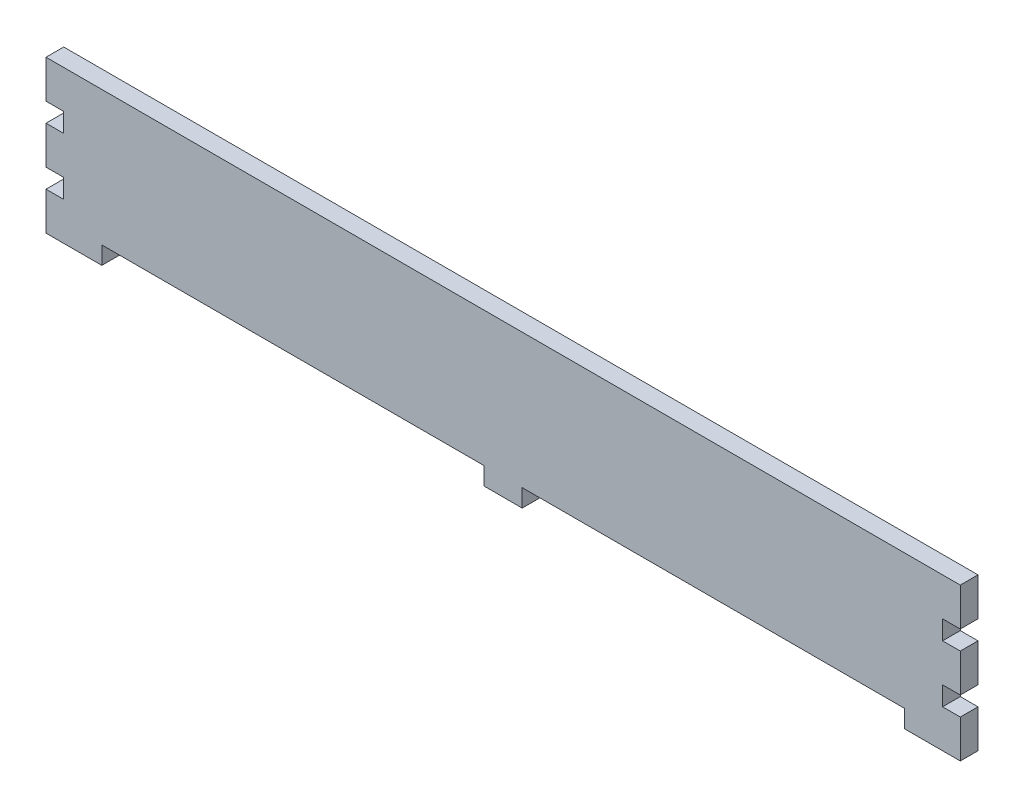
ISO-10303-21;
HEADER;
FILE_DESCRIPTION(('STEP AP214'),'2;1');
FILE_NAME('part.step','',(''),(''),'','','');
FILE_SCHEMA(('AUTOMOTIVE_DESIGN { 1 0 10303 214 1 1 1 1 }'));
ENDSEC;
DATA;
#1=APPLICATION_CONTEXT('core data for automotive mechanical design processes');
#2=APPLICATION_PROTOCOL_DEFINITION('international standard','automotive_design',2000,#1);
#3=PRODUCT_CONTEXT('',#1,'mechanical');
#4=PRODUCT('Part','Part','',(#3));
#5=PRODUCT_RELATED_PRODUCT_CATEGORY('part','',(#4));
#6=PRODUCT_DEFINITION_FORMATION('','',#4);
#7=PRODUCT_DEFINITION_CONTEXT('part definition',#1,'design');
#8=PRODUCT_DEFINITION('design','',#6,#7);
#9=PRODUCT_DEFINITION_SHAPE('','',#8);
#10=(LENGTH_UNIT() NAMED_UNIT(*) SI_UNIT(.MILLI.,.METRE.));
#11=(NAMED_UNIT(*) PLANE_ANGLE_UNIT() SI_UNIT($,.RADIAN.));
#12=(NAMED_UNIT(*) SI_UNIT($,.STERADIAN.) SOLID_ANGLE_UNIT());
#13=UNCERTAINTY_MEASURE_WITH_UNIT(LENGTH_MEASURE(1.E-05),#10,'distance_accuracy_value','');
#14=(GEOMETRIC_REPRESENTATION_CONTEXT(3) GLOBAL_UNCERTAINTY_ASSIGNED_CONTEXT((#13)) GLOBAL_UNIT_ASSIGNED_CONTEXT((#10,
#11,#12)) REPRESENTATION_CONTEXT('',''));
#15=CARTESIAN_POINT('',(0.,0.,0.));
#16=DIRECTION('',(0.,0.,1.));
#17=DIRECTION('',(1.,0.,0.));
#18=AXIS2_PLACEMENT_3D('',#15,#16,#17);
#19=CARTESIAN_POINT('',(140.590036334991,96.934215161976,11.81));
#20=DIRECTION('',(-1.,0.,0.));
#21=DIRECTION('',(0.,0.,1.));
#22=AXIS2_PLACEMENT_3D('',#19,#20,#21);
#23=PLANE('',#22);
#24=DIRECTION('',(0.,0.,1.));
#25=VECTOR('',#24,1.);
#26=CARTESIAN_POINT('',(140.590036334991,71.5342151619759,0.));
#27=LINE('',#26,#25);
#28=CARTESIAN_POINT('',(140.590036334991,71.5342151619759,0.));
#29=VERTEX_POINT('',#28);
#30=CARTESIAN_POINT('',(140.590036334991,71.5342151619759,11.81));
#31=VERTEX_POINT('',#30);
#32=EDGE_CURVE('E52',#29,#31,#27,.T.);
#33=ORIENTED_EDGE('',*,*,#32,.T.);
#34=DIRECTION('',(0.,1.,0.));
#35=VECTOR('',#34,1.);
#36=CARTESIAN_POINT('',(140.590036334991,96.934215161976,11.81));
#37=LINE('',#36,#35);
#38=CARTESIAN_POINT('',(140.590036334991,58.8342151619759,11.81));
#39=VERTEX_POINT('',#38);
#40=EDGE_CURVE('E431',#39,#31,#37,.T.);
#41=ORIENTED_EDGE('',*,*,#40,.F.);
#42=DIRECTION('',(0.,0.,1.));
#43=VECTOR('',#42,1.);
#44=CARTESIAN_POINT('',(140.590036334991,58.8342151619759,0.));
#45=LINE('',#44,#43);
#46=CARTESIAN_POINT('',(140.590036334991,58.8342151619759,0.));
#47=VERTEX_POINT('',#46);
#48=EDGE_CURVE('E282',#47,#39,#45,.T.);
#49=ORIENTED_EDGE('',*,*,#48,.F.);
#50=DIRECTION('',(0.,1.,0.));
#51=VECTOR('',#50,1.);
#52=CARTESIAN_POINT('',(140.590036334991,96.934215161976,0.));
#53=LINE('',#52,#51);
#54=EDGE_CURVE('E57',#47,#29,#53,.T.);
#55=ORIENTED_EDGE('',*,*,#54,.T.);
#56=EDGE_LOOP('',(#33,#41,#49,#55));
#57=FACE_BOUND('',#56,.T.);
#58=ADVANCED_FACE('F35',(#57),#23,.F.);
#59=DIRECTION('',(0.,0.,1.));
#60=VECTOR('',#59,1.);
#61=CARTESIAN_POINT('',(140.590036334991,33.4342151619759,0.));
#62=LINE('',#61,#60);
#63=CARTESIAN_POINT('',(140.590036334991,33.4342151619759,0.));
#64=VERTEX_POINT('',#63);
#65=CARTESIAN_POINT('',(140.590036334991,33.4342151619759,11.81));
#66=VERTEX_POINT('',#65);
#67=EDGE_CURVE('E280',#64,#66,#62,.T.);
#68=ORIENTED_EDGE('',*,*,#67,.T.);
#69=CARTESIAN_POINT('',(140.590036334991,20.7342151619759,11.81));
#70=VERTEX_POINT('',#69);
#71=EDGE_CURVE('E428',#70,#66,#37,.T.);
#72=ORIENTED_EDGE('',*,*,#71,.F.);
#73=DIRECTION('',(0.,0.,1.));
#74=VECTOR('',#73,1.);
#75=CARTESIAN_POINT('',(140.590036334991,20.7342151619759,0.));
#76=LINE('',#75,#74);
#77=CARTESIAN_POINT('',(140.590036334991,20.7342151619759,0.));
#78=VERTEX_POINT('',#77);
#79=EDGE_CURVE('E301',#78,#70,#76,.T.);
#80=ORIENTED_EDGE('',*,*,#79,.F.);
#81=EDGE_CURVE('E235',#78,#64,#53,.T.);
#82=ORIENTED_EDGE('',*,*,#81,.T.);
#83=EDGE_LOOP('',(#68,#72,#80,#82));
#84=FACE_BOUND('',#83,.T.);
#85=ADVANCED_FACE('F37',(#84),#23,.F.);
#86=CARTESIAN_POINT('',(-445.39,96.934215161976,11.81));
#87=DIRECTION('',(1.,0.,0.));
#88=DIRECTION('',(0.,0.,-1.));
#89=AXIS2_PLACEMENT_3D('',#86,#87,#88);
#90=PLANE('',#89);
#91=DIRECTION('',(0.,-1.,0.));
#92=VECTOR('',#91,1.);
#93=CARTESIAN_POINT('',(-445.39,96.934215161976,11.81));
#94=LINE('',#93,#92);
#95=CARTESIAN_POINT('',(-445.39,71.5342151619758,11.81));
#96=VERTEX_POINT('',#95);
#97=CARTESIAN_POINT('',(-445.39,58.8342151619758,11.81));
#98=VERTEX_POINT('',#97);
#99=EDGE_CURVE('E434',#96,#98,#94,.T.);
#100=ORIENTED_EDGE('',*,*,#99,.F.);
#101=DIRECTION('',(0.,0.,1.));
#102=VECTOR('',#101,1.);
#103=CARTESIAN_POINT('',(-445.39,71.5342151619758,0.));
#104=LINE('',#103,#102);
#105=CARTESIAN_POINT('',(-445.39,71.5342151619758,0.));
#106=VERTEX_POINT('',#105);
#107=EDGE_CURVE('E319',#106,#96,#104,.T.);
#108=ORIENTED_EDGE('',*,*,#107,.F.);
#109=DIRECTION('',(0.,-1.,0.));
#110=VECTOR('',#109,1.);
#111=CARTESIAN_POINT('',(-445.39,96.934215161976,0.));
#112=LINE('',#111,#110);
#113=CARTESIAN_POINT('',(-445.39,58.8342151619758,0.));
#114=VERTEX_POINT('',#113);
#115=EDGE_CURVE('E436',#106,#114,#112,.T.);
#116=ORIENTED_EDGE('',*,*,#115,.T.);
#117=DIRECTION('',(0.,0.,1.));
#118=VECTOR('',#117,1.);
#119=CARTESIAN_POINT('',(-445.39,58.8342151619758,0.));
#120=LINE('',#119,#118);
#121=EDGE_CURVE('E344',#114,#98,#120,.T.);
#122=ORIENTED_EDGE('',*,*,#121,.T.);
#123=EDGE_LOOP('',(#100,#108,#116,#122));
#124=FACE_BOUND('',#123,.T.);
#125=ADVANCED_FACE('F469',(#124),#90,.F.);
#126=CARTESIAN_POINT('',(-445.39,7.14421516197585,11.81));
#127=DIRECTION('',(0.,1.,0.));
#128=DIRECTION('',(-1.,0.,0.));
#129=AXIS2_PLACEMENT_3D('',#126,#127,#128);
#130=PLANE('',#129);
#131=DIRECTION('',(1.,0.,0.));
#132=VECTOR('',#131,1.);
#133=CARTESIAN_POINT('',(-445.39,7.14421516197585,0.));
#134=LINE('',#133,#132);
#135=CARTESIAN_POINT('',(-419.99,7.14421516197584,0.));
#136=VERTEX_POINT('',#135);
#137=CARTESIAN_POINT('',(-165.099981832504,7.14421516197579,0.));
#138=VERTEX_POINT('',#137);
#139=EDGE_CURVE('E39',#136,#138,#134,.T.);
#140=ORIENTED_EDGE('',*,*,#139,.T.);
#141=DIRECTION('',(0.,0.,1.));
#142=VECTOR('',#141,1.);
#143=CARTESIAN_POINT('',(-165.099981832504,7.14421516197579,0.));
#144=LINE('',#143,#142);
#145=CARTESIAN_POINT('',(-165.099981832504,7.14421516197579,11.81));
#146=VERTEX_POINT('',#145);
#147=EDGE_CURVE('E403',#138,#146,#144,.T.);
#148=ORIENTED_EDGE('',*,*,#147,.T.);
#149=DIRECTION('',(1.,0.,0.));
#150=VECTOR('',#149,1.);
#151=CARTESIAN_POINT('',(-445.39,7.14421516197585,11.81));
#152=LINE('',#151,#150);
#153=CARTESIAN_POINT('',(-419.99,7.14421516197585,11.81));
#154=VERTEX_POINT('',#153);
#155=EDGE_CURVE('E11',#154,#146,#152,.T.);
#156=ORIENTED_EDGE('',*,*,#155,.F.);
#157=DIRECTION('',(0.,0.,1.));
#158=VECTOR('',#157,1.);
#159=CARTESIAN_POINT('',(-419.99,7.14421516197585,0.));
#160=LINE('',#159,#158);
#161=EDGE_CURVE('E424',#136,#154,#160,.T.);
#162=ORIENTED_EDGE('',*,*,#161,.F.);
#163=EDGE_LOOP('',(#140,#148,#156,#162));
#164=FACE_BOUND('',#163,.T.);
#165=ADVANCED_FACE('F534',(#164),#130,.F.);
#166=CARTESIAN_POINT('',(-139.699981832504,7.14421516197579,0.));
#167=VERTEX_POINT('',#166);
#168=CARTESIAN_POINT('',(115.190036334991,7.14421516197574,0.));
#169=VERTEX_POINT('',#168);
#170=EDGE_CURVE('E437',#167,#169,#134,.T.);
#171=ORIENTED_EDGE('',*,*,#170,.T.);
#172=DIRECTION('',(0.,0.,1.));
#173=VECTOR('',#172,1.);
#174=CARTESIAN_POINT('',(115.190036334991,7.14421516197573,0.));
#175=LINE('',#174,#173);
#176=CARTESIAN_POINT('',(115.190036334991,7.14421516197574,11.81));
#177=VERTEX_POINT('',#176);
#178=EDGE_CURVE('E381',#169,#177,#175,.T.);
#179=ORIENTED_EDGE('',*,*,#178,.T.);
#180=CARTESIAN_POINT('',(-139.699981832504,7.14421516197579,11.81));
#181=VERTEX_POINT('',#180);
#182=EDGE_CURVE('E44',#181,#177,#152,.T.);
#183=ORIENTED_EDGE('',*,*,#182,.F.);
#184=DIRECTION('',(0.,0.,1.));
#185=VECTOR('',#184,1.);
#186=CARTESIAN_POINT('',(-139.699981832504,7.14421516197579,0.));
#187=LINE('',#186,#185);
#188=EDGE_CURVE('E406',#167,#181,#187,.T.);
#189=ORIENTED_EDGE('',*,*,#188,.F.);
#190=EDGE_LOOP('',(#171,#179,#183,#189));
#191=FACE_BOUND('',#190,.T.);
#192=ADVANCED_FACE('F512',(#191),#130,.F.);
#193=CARTESIAN_POINT('',(-445.39,96.934215161976,11.81));
#194=DIRECTION('',(0.,-1.,0.));
#195=DIRECTION('',(0.,0.,-1.));
#196=AXIS2_PLACEMENT_3D('',#193,#194,#195);
#197=PLANE('',#196);
#198=DIRECTION('',(-1.,0.,0.));
#199=VECTOR('',#198,1.);
#200=CARTESIAN_POINT('',(-445.39,96.934215161976,0.));
#201=LINE('',#200,#199);
#202=CARTESIAN_POINT('',(152.400036334991,96.9342151619759,0.));
#203=VERTEX_POINT('',#202);
#204=CARTESIAN_POINT('',(-457.2,96.9342151619758,0.));
#205=VERTEX_POINT('',#204);
#206=EDGE_CURVE('E221',#203,#205,#201,.T.);
#207=ORIENTED_EDGE('',*,*,#206,.T.);
#208=DIRECTION('',(0.,0.,1.));
#209=VECTOR('',#208,1.);
#210=CARTESIAN_POINT('',(-457.2,96.9342151619758,0.));
#211=LINE('',#210,#209);
#212=CARTESIAN_POINT('',(-457.2,96.9342151619758,11.81));
#213=VERTEX_POINT('',#212);
#214=EDGE_CURVE('E316',#205,#213,#211,.T.);
#215=ORIENTED_EDGE('',*,*,#214,.T.);
#216=DIRECTION('',(-1.,0.,0.));
#217=VECTOR('',#216,1.);
#218=CARTESIAN_POINT('',(-445.39,96.934215161976,11.81));
#219=LINE('',#218,#217);
#220=CARTESIAN_POINT('',(152.400036334991,96.9342151619759,11.81));
#221=VERTEX_POINT('',#220);
#222=EDGE_CURVE('E240',#221,#213,#219,.T.);
#223=ORIENTED_EDGE('',*,*,#222,.F.);
#224=DIRECTION('',(0.,0.,1.));
#225=VECTOR('',#224,1.);
#226=CARTESIAN_POINT('',(152.400036334991,96.9342151619759,0.));
#227=LINE('',#226,#225);
#228=EDGE_CURVE('E238',#203,#221,#227,.T.);
#229=ORIENTED_EDGE('',*,*,#228,.F.);
#230=EDGE_LOOP('',(#207,#215,#223,#229));
#231=FACE_BOUND('',#230,.T.);
#232=ADVANCED_FACE('F239',(#231),#197,.F.);
#233=CARTESIAN_POINT('',(-445.39,33.4342151619758,11.81));
#234=VERTEX_POINT('',#233);
#235=CARTESIAN_POINT('',(-445.39,20.7342151619759,11.81));
#236=VERTEX_POINT('',#235);
#237=EDGE_CURVE('E433',#234,#236,#94,.T.);
#238=ORIENTED_EDGE('',*,*,#237,.F.);
#239=DIRECTION('',(0.,0.,1.));
#240=VECTOR('',#239,1.);
#241=CARTESIAN_POINT('',(-445.39,33.4342151619758,0.));
#242=LINE('',#241,#240);
#243=CARTESIAN_POINT('',(-445.39,33.4342151619758,0.));
#244=VERTEX_POINT('',#243);
#245=EDGE_CURVE('E347',#244,#234,#242,.T.);
#246=ORIENTED_EDGE('',*,*,#245,.F.);
#247=CARTESIAN_POINT('',(-445.39,20.7342151619759,0.));
#248=VERTEX_POINT('',#247);
#249=EDGE_CURVE('E234',#244,#248,#112,.T.);
#250=ORIENTED_EDGE('',*,*,#249,.T.);
#251=DIRECTION('',(0.,0.,1.));
#252=VECTOR('',#251,1.);
#253=CARTESIAN_POINT('',(-445.39,20.7342151619759,0.));
#254=LINE('',#253,#252);
#255=EDGE_CURVE('E366',#248,#236,#254,.T.);
#256=ORIENTED_EDGE('',*,*,#255,.T.);
#257=EDGE_LOOP('',(#238,#246,#250,#256));
#258=FACE_BOUND('',#257,.T.);
#259=ADVANCED_FACE('F444',(#258),#90,.F.);
#260=CARTESIAN_POINT('',(0.,0.,11.81));
#261=DIRECTION('',(0.,0.,1.));
#262=DIRECTION('',(1.,0.,0.));
#263=AXIS2_PLACEMENT_3D('',#260,#261,#262);
#264=PLANE('',#263);
#265=DIRECTION('',(1.,0.,0.));
#266=VECTOR('',#265,1.);
#267=CARTESIAN_POINT('',(115.190036334991,-4.66578483802427,11.81));
#268=LINE('',#267,#266);
#269=CARTESIAN_POINT('',(115.190036334991,-4.66578483802427,11.81));
#270=VERTEX_POINT('',#269);
#271=CARTESIAN_POINT('',(152.400036334991,-4.6657848380241,11.81));
#272=VERTEX_POINT('',#271);
#273=EDGE_CURVE('E375',#270,#272,#268,.T.);
#274=ORIENTED_EDGE('',*,*,#273,.T.);
#275=DIRECTION('',(0.,-1.,0.));
#276=VECTOR('',#275,1.);
#277=CARTESIAN_POINT('',(152.400036334991,-4.6657848380241,11.81));
#278=LINE('',#277,#276);
#279=CARTESIAN_POINT('',(152.400036334991,20.7342151619759,11.81));
#280=VERTEX_POINT('',#279);
#281=EDGE_CURVE('E279',#280,#272,#278,.T.);
#282=ORIENTED_EDGE('',*,*,#281,.F.);
#283=DIRECTION('',(1.,0.,0.));
#284=VECTOR('',#283,1.);
#285=CARTESIAN_POINT('',(152.400036334991,20.7342151619759,11.81));
#286=LINE('',#285,#284);
#287=EDGE_CURVE('E291',#70,#280,#286,.T.);
#288=ORIENTED_EDGE('',*,*,#287,.F.);
#289=ORIENTED_EDGE('',*,*,#71,.T.);
#290=DIRECTION('',(-1.,0.,0.));
#291=VECTOR('',#290,1.);
#292=CARTESIAN_POINT('',(152.400036334991,33.4342151619759,11.81));
#293=LINE('',#292,#291);
#294=CARTESIAN_POINT('',(152.400036334991,33.4342151619759,11.81));
#295=VERTEX_POINT('',#294);
#296=EDGE_CURVE('E264',#295,#66,#293,.T.);
#297=ORIENTED_EDGE('',*,*,#296,.F.);
#298=DIRECTION('',(0.,-1.,0.));
#299=VECTOR('',#298,1.);
#300=CARTESIAN_POINT('',(152.400036334991,33.4342151619759,11.81));
#301=LINE('',#300,#299);
#302=CARTESIAN_POINT('',(152.400036334991,58.8342151619759,11.81));
#303=VERTEX_POINT('',#302);
#304=EDGE_CURVE('E258',#303,#295,#301,.T.);
#305=ORIENTED_EDGE('',*,*,#304,.F.);
#306=DIRECTION('',(1.,0.,0.));
#307=VECTOR('',#306,1.);
#308=CARTESIAN_POINT('',(152.400036334991,58.8342151619759,11.81));
#309=LINE('',#308,#307);
#310=EDGE_CURVE('E272',#39,#303,#309,.T.);
#311=ORIENTED_EDGE('',*,*,#310,.F.);
#312=ORIENTED_EDGE('',*,*,#40,.T.);
#313=DIRECTION('',(-1.,0.,0.));
#314=VECTOR('',#313,1.);
#315=CARTESIAN_POINT('',(152.400036334991,71.5342151619759,11.81));
#316=LINE('',#315,#314);
#317=CARTESIAN_POINT('',(152.400036334991,71.5342151619759,11.81));
#318=VERTEX_POINT('',#317);
#319=EDGE_CURVE('E249',#318,#31,#316,.T.);
#320=ORIENTED_EDGE('',*,*,#319,.F.);
#321=DIRECTION('',(0.,-1.,0.));
#322=VECTOR('',#321,1.);
#323=CARTESIAN_POINT('',(152.400036334991,71.5342151619759,11.81));
#324=LINE('',#323,#322);
#325=EDGE_CURVE('E253',#221,#318,#324,.T.);
#326=ORIENTED_EDGE('',*,*,#325,.F.);
#327=ORIENTED_EDGE('',*,*,#222,.T.);
#328=DIRECTION('',(0.,-1.,0.));
#329=VECTOR('',#328,1.);
#330=CARTESIAN_POINT('',(-457.2,71.5342151619758,11.81));
#331=LINE('',#330,#329);
#332=CARTESIAN_POINT('',(-457.2,71.5342151619758,11.81));
#333=VERTEX_POINT('',#332);
#334=EDGE_CURVE('E300',#213,#333,#331,.T.);
#335=ORIENTED_EDGE('',*,*,#334,.T.);
#336=DIRECTION('',(1.,0.,0.));
#337=VECTOR('',#336,1.);
#338=CARTESIAN_POINT('',(-457.2,71.5342151619758,11.81));
#339=LINE('',#338,#337);
#340=EDGE_CURVE('E308',#333,#96,#339,.T.);
#341=ORIENTED_EDGE('',*,*,#340,.T.);
#342=ORIENTED_EDGE('',*,*,#99,.T.);
#343=DIRECTION('',(-1.,0.,0.));
#344=VECTOR('',#343,1.);
#345=CARTESIAN_POINT('',(-457.2,58.8342151619758,11.81));
#346=LINE('',#345,#344);
#347=CARTESIAN_POINT('',(-457.2,58.8342151619758,11.81));
#348=VERTEX_POINT('',#347);
#349=EDGE_CURVE('E327',#98,#348,#346,.T.);
#350=ORIENTED_EDGE('',*,*,#349,.T.);
#351=DIRECTION('',(0.,-1.,0.));
#352=VECTOR('',#351,1.);
#353=CARTESIAN_POINT('',(-457.2,33.4342151619758,11.81));
#354=LINE('',#353,#352);
#355=CARTESIAN_POINT('',(-457.2,33.4342151619758,11.81));
#356=VERTEX_POINT('',#355);
#357=EDGE_CURVE('E318',#348,#356,#354,.T.);
#358=ORIENTED_EDGE('',*,*,#357,.T.);
#359=DIRECTION('',(1.,0.,0.));
#360=VECTOR('',#359,1.);
#361=CARTESIAN_POINT('',(-457.2,33.4342151619758,11.81));
#362=LINE('',#361,#360);
#363=EDGE_CURVE('E336',#356,#234,#362,.T.);
#364=ORIENTED_EDGE('',*,*,#363,.T.);
#365=ORIENTED_EDGE('',*,*,#237,.T.);
#366=DIRECTION('',(-1.,0.,0.));
#367=VECTOR('',#366,1.);
#368=CARTESIAN_POINT('',(-457.2,20.7342151619759,11.81));
#369=LINE('',#368,#367);
#370=CARTESIAN_POINT('',(-457.2,20.7342151619759,11.81));
#371=VERTEX_POINT('',#370);
#372=EDGE_CURVE('E355',#236,#371,#369,.T.);
#373=ORIENTED_EDGE('',*,*,#372,.T.);
#374=DIRECTION('',(0.,-1.,0.));
#375=VECTOR('',#374,1.);
#376=CARTESIAN_POINT('',(-457.2,-4.66578483802416,11.81));
#377=LINE('',#376,#375);
#378=CARTESIAN_POINT('',(-457.2,-4.66578483802416,11.81));
#379=VERTEX_POINT('',#378);
#380=EDGE_CURVE('E343',#371,#379,#377,.T.);
#381=ORIENTED_EDGE('',*,*,#380,.T.);
#382=DIRECTION('',(1.,0.,0.));
#383=VECTOR('',#382,1.);
#384=CARTESIAN_POINT('',(-445.39,-4.66578483802416,11.81));
#385=LINE('',#384,#383);
#386=CARTESIAN_POINT('',(-419.99,-4.66578483802416,11.81));
#387=VERTEX_POINT('',#386);
#388=EDGE_CURVE('E405',#379,#387,#385,.T.);
#389=ORIENTED_EDGE('',*,*,#388,.T.);
#390=DIRECTION('',(0.,1.,0.));
#391=VECTOR('',#390,1.);
#392=CARTESIAN_POINT('',(-419.99,-4.66578483802416,11.81));
#393=LINE('',#392,#391);
#394=EDGE_CURVE('E416',#387,#154,#393,.T.);
#395=ORIENTED_EDGE('',*,*,#394,.T.);
#396=ORIENTED_EDGE('',*,*,#155,.T.);
#397=DIRECTION('',(0.,-1.,0.));
#398=VECTOR('',#397,1.);
#399=CARTESIAN_POINT('',(-165.099981832504,-4.66578483802421,11.81));
#400=LINE('',#399,#398);
#401=CARTESIAN_POINT('',(-165.099981832504,-4.66578483802421,11.81));
#402=VERTEX_POINT('',#401);
#403=EDGE_CURVE('E383',#146,#402,#400,.T.);
#404=ORIENTED_EDGE('',*,*,#403,.T.);
#405=DIRECTION('',(1.,0.,0.));
#406=VECTOR('',#405,1.);
#407=CARTESIAN_POINT('',(-165.099981832504,-4.66578483802421,11.81));
#408=LINE('',#407,#406);
#409=CARTESIAN_POINT('',(-139.699981832504,-4.66578483802421,11.81));
#410=VERTEX_POINT('',#409);
#411=EDGE_CURVE('E398',#402,#410,#408,.T.);
#412=ORIENTED_EDGE('',*,*,#411,.T.);
#413=DIRECTION('',(0.,1.,0.));
#414=VECTOR('',#413,1.);
#415=CARTESIAN_POINT('',(-139.699981832504,-4.66578483802421,11.81));
#416=LINE('',#415,#414);
#417=EDGE_CURVE('E389',#410,#181,#416,.T.);
#418=ORIENTED_EDGE('',*,*,#417,.T.);
#419=ORIENTED_EDGE('',*,*,#182,.T.);
#420=DIRECTION('',(0.,-1.,0.));
#421=VECTOR('',#420,1.);
#422=CARTESIAN_POINT('',(115.190036334991,-4.66578483802427,11.81));
#423=LINE('',#422,#421);
#424=EDGE_CURVE('E365',#177,#270,#423,.T.);
#425=ORIENTED_EDGE('',*,*,#424,.T.);
#426=EDGE_LOOP('',(#274,#282,#288,#289,#297,#305,#311,#312,#320,#326,#327,#335,#341,#342,#350,
#358,#364,#365,#373,#381,#389,#395,#396,#404,#412,#418,#419,#425));
#427=FACE_BOUND('',#426,.T.);
#428=ADVANCED_FACE('F457',(#427),#264,.T.);
#429=CARTESIAN_POINT('',(0.,0.,0.));
#430=DIRECTION('',(0.,0.,1.));
#431=DIRECTION('',(1.,0.,0.));
#432=AXIS2_PLACEMENT_3D('',#429,#430,#431);
#433=PLANE('',#432);
#434=ORIENTED_EDGE('',*,*,#81,.F.);
#435=DIRECTION('',(1.,0.,0.));
#436=VECTOR('',#435,1.);
#437=CARTESIAN_POINT('',(152.400036334991,20.7342151619759,0.));
#438=LINE('',#437,#436);
#439=CARTESIAN_POINT('',(152.400036334991,20.7342151619759,0.));
#440=VERTEX_POINT('',#439);
#441=EDGE_CURVE('E290',#78,#440,#438,.T.);
#442=ORIENTED_EDGE('',*,*,#441,.T.);
#443=DIRECTION('',(0.,-1.,0.));
#444=VECTOR('',#443,1.);
#445=CARTESIAN_POINT('',(152.400036334991,-4.6657848380241,0.));
#446=LINE('',#445,#444);
#447=CARTESIAN_POINT('',(152.400036334991,-4.6657848380241,0.));
#448=VERTEX_POINT('',#447);
#449=EDGE_CURVE('E287',#440,#448,#446,.T.);
#450=ORIENTED_EDGE('',*,*,#449,.T.);
#451=DIRECTION('',(1.,0.,0.));
#452=VECTOR('',#451,1.);
#453=CARTESIAN_POINT('',(115.190036334991,-4.66578483802427,0.));
#454=LINE('',#453,#452);
#455=CARTESIAN_POINT('',(115.190036334991,-4.66578483802427,0.));
#456=VERTEX_POINT('',#455);
#457=EDGE_CURVE('E374',#456,#448,#454,.T.);
#458=ORIENTED_EDGE('',*,*,#457,.F.);
#459=DIRECTION('',(0.,-1.,0.));
#460=VECTOR('',#459,1.);
#461=CARTESIAN_POINT('',(115.190036334991,-4.66578483802427,0.));
#462=LINE('',#461,#460);
#463=EDGE_CURVE('E371',#169,#456,#462,.T.);
#464=ORIENTED_EDGE('',*,*,#463,.F.);
#465=ORIENTED_EDGE('',*,*,#170,.F.);
#466=DIRECTION('',(0.,1.,0.));
#467=VECTOR('',#466,1.);
#468=CARTESIAN_POINT('',(-139.699981832504,-4.66578483802421,0.));
#469=LINE('',#468,#467);
#470=CARTESIAN_POINT('',(-139.699981832504,-4.66578483802421,0.));
#471=VERTEX_POINT('',#470);
#472=EDGE_CURVE('E392',#471,#167,#469,.T.);
#473=ORIENTED_EDGE('',*,*,#472,.F.);
#474=DIRECTION('',(1.,0.,0.));
#475=VECTOR('',#474,1.);
#476=CARTESIAN_POINT('',(-165.099981832504,-4.66578483802421,0.));
#477=LINE('',#476,#475);
#478=CARTESIAN_POINT('',(-165.099981832504,-4.66578483802421,0.));
#479=VERTEX_POINT('',#478);
#480=EDGE_CURVE('E388',#479,#471,#477,.T.);
#481=ORIENTED_EDGE('',*,*,#480,.F.);
#482=DIRECTION('',(0.,-1.,0.));
#483=VECTOR('',#482,1.);
#484=CARTESIAN_POINT('',(-165.099981832504,-4.66578483802421,0.));
#485=LINE('',#484,#483);
#486=EDGE_CURVE('E385',#138,#479,#485,.T.);
#487=ORIENTED_EDGE('',*,*,#486,.F.);
#488=ORIENTED_EDGE('',*,*,#139,.F.);
#489=DIRECTION('',(0.,1.,0.));
#490=VECTOR('',#489,1.);
#491=CARTESIAN_POINT('',(-419.99,-4.66578483802416,0.));
#492=LINE('',#491,#490);
#493=CARTESIAN_POINT('',(-419.99,-4.66578483802416,0.));
#494=VERTEX_POINT('',#493);
#495=EDGE_CURVE('E415',#494,#136,#492,.T.);
#496=ORIENTED_EDGE('',*,*,#495,.F.);
#497=DIRECTION('',(1.,0.,0.));
#498=VECTOR('',#497,1.);
#499=CARTESIAN_POINT('',(-445.39,-4.66578483802416,0.));
#500=LINE('',#499,#498);
#501=CARTESIAN_POINT('',(-457.2,-4.66578483802416,0.));
#502=VERTEX_POINT('',#501);
#503=EDGE_CURVE('E412',#502,#494,#500,.T.);
#504=ORIENTED_EDGE('',*,*,#503,.F.);
#505=DIRECTION('',(0.,-1.,0.));
#506=VECTOR('',#505,1.);
#507=CARTESIAN_POINT('',(-457.2,-4.66578483802416,0.));
#508=LINE('',#507,#506);
#509=CARTESIAN_POINT('',(-457.2,20.7342151619759,0.));
#510=VERTEX_POINT('',#509);
#511=EDGE_CURVE('E351',#510,#502,#508,.T.);
#512=ORIENTED_EDGE('',*,*,#511,.F.);
#513=DIRECTION('',(-1.,0.,0.));
#514=VECTOR('',#513,1.);
#515=CARTESIAN_POINT('',(-457.2,20.7342151619759,0.));
#516=LINE('',#515,#514);
#517=EDGE_CURVE('E354',#248,#510,#516,.T.);
#518=ORIENTED_EDGE('',*,*,#517,.F.);
#519=ORIENTED_EDGE('',*,*,#249,.F.);
#520=DIRECTION('',(1.,0.,0.));
#521=VECTOR('',#520,1.);
#522=CARTESIAN_POINT('',(-457.2,33.4342151619758,0.));
#523=LINE('',#522,#521);
#524=CARTESIAN_POINT('',(-457.2,33.4342151619758,0.));
#525=VERTEX_POINT('',#524);
#526=EDGE_CURVE('E326',#525,#244,#523,.T.);
#527=ORIENTED_EDGE('',*,*,#526,.F.);
#528=DIRECTION('',(0.,-1.,0.));
#529=VECTOR('',#528,1.);
#530=CARTESIAN_POINT('',(-457.2,33.4342151619758,0.));
#531=LINE('',#530,#529);
#532=CARTESIAN_POINT('',(-457.2,58.8342151619758,0.));
#533=VERTEX_POINT('',#532);
#534=EDGE_CURVE('E323',#533,#525,#531,.T.);
#535=ORIENTED_EDGE('',*,*,#534,.F.);
#536=DIRECTION('',(-1.,0.,0.));
#537=VECTOR('',#536,1.);
#538=CARTESIAN_POINT('',(-457.2,58.8342151619758,0.));
#539=LINE('',#538,#537);
#540=EDGE_CURVE('E330',#114,#533,#539,.T.);
#541=ORIENTED_EDGE('',*,*,#540,.F.);
#542=ORIENTED_EDGE('',*,*,#115,.F.);
#543=DIRECTION('',(1.,0.,0.));
#544=VECTOR('',#543,1.);
#545=CARTESIAN_POINT('',(-457.2,71.5342151619758,0.));
#546=LINE('',#545,#544);
#547=CARTESIAN_POINT('',(-457.2,71.5342151619758,0.));
#548=VERTEX_POINT('',#547);
#549=EDGE_CURVE('E307',#548,#106,#546,.T.);
#550=ORIENTED_EDGE('',*,*,#549,.F.);
#551=DIRECTION('',(0.,-1.,0.));
#552=VECTOR('',#551,1.);
#553=CARTESIAN_POINT('',(-457.2,71.5342151619758,0.));
#554=LINE('',#553,#552);
#555=EDGE_CURVE('E230',#205,#548,#554,.T.);
#556=ORIENTED_EDGE('',*,*,#555,.F.);
#557=ORIENTED_EDGE('',*,*,#206,.F.);
#558=DIRECTION('',(0.,-1.,0.));
#559=VECTOR('',#558,1.);
#560=CARTESIAN_POINT('',(152.400036334991,71.5342151619759,0.));
#561=LINE('',#560,#559);
#562=CARTESIAN_POINT('',(152.400036334991,71.5342151619759,0.));
#563=VERTEX_POINT('',#562);
#564=EDGE_CURVE('E226',#203,#563,#561,.T.);
#565=ORIENTED_EDGE('',*,*,#564,.T.);
#566=DIRECTION('',(-1.,0.,0.));
#567=VECTOR('',#566,1.);
#568=CARTESIAN_POINT('',(152.400036334991,71.5342151619759,0.));
#569=LINE('',#568,#567);
#570=EDGE_CURVE('E244',#563,#29,#569,.T.);
#571=ORIENTED_EDGE('',*,*,#570,.T.);
#572=ORIENTED_EDGE('',*,*,#54,.F.);
#573=DIRECTION('',(1.,0.,0.));
#574=VECTOR('',#573,1.);
#575=CARTESIAN_POINT('',(152.400036334991,58.8342151619759,0.));
#576=LINE('',#575,#574);
#577=CARTESIAN_POINT('',(152.400036334991,58.8342151619759,0.));
#578=VERTEX_POINT('',#577);
#579=EDGE_CURVE('E263',#47,#578,#576,.T.);
#580=ORIENTED_EDGE('',*,*,#579,.T.);
#581=DIRECTION('',(0.,-1.,0.));
#582=VECTOR('',#581,1.);
#583=CARTESIAN_POINT('',(152.400036334991,33.4342151619759,0.));
#584=LINE('',#583,#582);
#585=CARTESIAN_POINT('',(152.400036334991,33.4342151619759,0.));
#586=VERTEX_POINT('',#585);
#587=EDGE_CURVE('E260',#578,#586,#584,.T.);
#588=ORIENTED_EDGE('',*,*,#587,.T.);
#589=DIRECTION('',(-1.,0.,0.));
#590=VECTOR('',#589,1.);
#591=CARTESIAN_POINT('',(152.400036334991,33.4342151619759,0.));
#592=LINE('',#591,#590);
#593=EDGE_CURVE('E266',#586,#64,#592,.T.);
#594=ORIENTED_EDGE('',*,*,#593,.T.);
#595=EDGE_LOOP('',(#434,#442,#450,#458,#464,#465,#473,#481,#487,#488,#496,#504,#512,#518,#519,
#527,#535,#541,#542,#550,#556,#557,#565,#571,#572,#580,#588,#594));
#596=FACE_BOUND('',#595,.T.);
#597=ADVANCED_FACE('F224',(#596),#433,.F.);
#598=CARTESIAN_POINT('',(-419.99,-4.66578483802416,0.));
#599=DIRECTION('',(1.,0.,0.));
#600=DIRECTION('',(0.,0.,-1.));
#601=AXIS2_PLACEMENT_3D('',#598,#599,#600);
#602=PLANE('',#601);
#603=ORIENTED_EDGE('',*,*,#394,.F.);
#604=DIRECTION('',(0.,0.,1.));
#605=VECTOR('',#604,1.);
#606=CARTESIAN_POINT('',(-419.99,-4.66578483802416,0.));
#607=LINE('',#606,#605);
#608=EDGE_CURVE('E419',#494,#387,#607,.T.);
#609=ORIENTED_EDGE('',*,*,#608,.F.);
#610=ORIENTED_EDGE('',*,*,#495,.T.);
#611=ORIENTED_EDGE('',*,*,#161,.T.);
#612=EDGE_LOOP('',(#603,#609,#610,#611));
#613=FACE_BOUND('',#612,.T.);
#614=ADVANCED_FACE('F531',(#613),#602,.T.);
#615=CARTESIAN_POINT('',(-445.39,-4.66578483802416,0.));
#616=DIRECTION('',(0.,-1.,0.));
#617=DIRECTION('',(0.,0.,-1.));
#618=AXIS2_PLACEMENT_3D('',#615,#616,#617);
#619=PLANE('',#618);
#620=ORIENTED_EDGE('',*,*,#388,.F.);
#621=DIRECTION('',(0.,0.,1.));
#622=VECTOR('',#621,1.);
#623=CARTESIAN_POINT('',(-457.2,-4.66578483802416,0.));
#624=LINE('',#623,#622);
#625=EDGE_CURVE('E358',#502,#379,#624,.T.);
#626=ORIENTED_EDGE('',*,*,#625,.F.);
#627=ORIENTED_EDGE('',*,*,#503,.T.);
#628=ORIENTED_EDGE('',*,*,#608,.T.);
#629=EDGE_LOOP('',(#620,#626,#627,#628));
#630=FACE_BOUND('',#629,.T.);
#631=ADVANCED_FACE('F533',(#630),#619,.T.);
#632=CARTESIAN_POINT('',(-165.099981832504,-4.66578483802421,0.));
#633=DIRECTION('',(-1.,0.,0.));
#634=DIRECTION('',(0.,0.,1.));
#635=AXIS2_PLACEMENT_3D('',#632,#633,#634);
#636=PLANE('',#635);
#637=ORIENTED_EDGE('',*,*,#403,.F.);
#638=ORIENTED_EDGE('',*,*,#147,.F.);
#639=ORIENTED_EDGE('',*,*,#486,.T.);
#640=DIRECTION('',(0.,0.,1.));
#641=VECTOR('',#640,1.);
#642=CARTESIAN_POINT('',(-165.099981832504,-4.66578483802421,0.));
#643=LINE('',#642,#641);
#644=EDGE_CURVE('E395',#479,#402,#643,.T.);
#645=ORIENTED_EDGE('',*,*,#644,.T.);
#646=EDGE_LOOP('',(#637,#638,#639,#645));
#647=FACE_BOUND('',#646,.T.);
#648=ADVANCED_FACE('F525',(#647),#636,.T.);
#649=CARTESIAN_POINT('',(-139.699981832504,-4.66578483802421,0.));
#650=DIRECTION('',(1.,0.,0.));
#651=DIRECTION('',(0.,0.,-1.));
#652=AXIS2_PLACEMENT_3D('',#649,#650,#651);
#653=PLANE('',#652);
#654=ORIENTED_EDGE('',*,*,#417,.F.);
#655=DIRECTION('',(0.,0.,1.));
#656=VECTOR('',#655,1.);
#657=CARTESIAN_POINT('',(-139.699981832504,-4.66578483802421,0.));
#658=LINE('',#657,#656);
#659=EDGE_CURVE('E409',#471,#410,#658,.T.);
#660=ORIENTED_EDGE('',*,*,#659,.F.);
#661=ORIENTED_EDGE('',*,*,#472,.T.);
#662=ORIENTED_EDGE('',*,*,#188,.T.);
#663=EDGE_LOOP('',(#654,#660,#661,#662));
#664=FACE_BOUND('',#663,.T.);
#665=ADVANCED_FACE('F517',(#664),#653,.T.);
#666=CARTESIAN_POINT('',(-165.099981832504,-4.66578483802421,0.));
#667=DIRECTION('',(0.,-1.,0.));
#668=DIRECTION('',(0.,0.,-1.));
#669=AXIS2_PLACEMENT_3D('',#666,#667,#668);
#670=PLANE('',#669);
#671=ORIENTED_EDGE('',*,*,#411,.F.);
#672=ORIENTED_EDGE('',*,*,#644,.F.);
#673=ORIENTED_EDGE('',*,*,#480,.T.);
#674=ORIENTED_EDGE('',*,*,#659,.T.);
#675=EDGE_LOOP('',(#671,#672,#673,#674));
#676=FACE_BOUND('',#675,.T.);
#677=ADVANCED_FACE('F522',(#676),#670,.T.);
#678=CARTESIAN_POINT('',(115.190036334991,-4.66578483802427,0.));
#679=DIRECTION('',(-1.,0.,0.));
#680=DIRECTION('',(0.,0.,1.));
#681=AXIS2_PLACEMENT_3D('',#678,#679,#680);
#682=PLANE('',#681);
#683=ORIENTED_EDGE('',*,*,#424,.F.);
#684=ORIENTED_EDGE('',*,*,#178,.F.);
#685=ORIENTED_EDGE('',*,*,#463,.T.);
#686=DIRECTION('',(0.,0.,1.));
#687=VECTOR('',#686,1.);
#688=CARTESIAN_POINT('',(115.190036334991,-4.66578483802427,0.));
#689=LINE('',#688,#687);
#690=EDGE_CURVE('E377',#456,#270,#689,.T.);
#691=ORIENTED_EDGE('',*,*,#690,.T.);
#692=EDGE_LOOP('',(#683,#684,#685,#691));
#693=FACE_BOUND('',#692,.T.);
#694=ADVANCED_FACE('F508',(#693),#682,.T.);
#695=CARTESIAN_POINT('',(115.190036334991,-4.66578483802427,0.));
#696=DIRECTION('',(0.,-1.,0.));
#697=DIRECTION('',(0.,0.,-1.));
#698=AXIS2_PLACEMENT_3D('',#695,#696,#697);
#699=PLANE('',#698);
#700=ORIENTED_EDGE('',*,*,#273,.F.);
#701=ORIENTED_EDGE('',*,*,#690,.F.);
#702=ORIENTED_EDGE('',*,*,#457,.T.);
#703=DIRECTION('',(0.,0.,1.));
#704=VECTOR('',#703,1.);
#705=CARTESIAN_POINT('',(152.400036334991,-4.6657848380241,0.));
#706=LINE('',#705,#704);
#707=EDGE_CURVE('E297',#448,#272,#706,.T.);
#708=ORIENTED_EDGE('',*,*,#707,.T.);
#709=EDGE_LOOP('',(#700,#701,#702,#708));
#710=FACE_BOUND('',#709,.T.);
#711=ADVANCED_FACE('F707',(#710),#699,.T.);
#712=CARTESIAN_POINT('',(-457.2,-4.66578483802416,0.));
#713=DIRECTION('',(-1.,0.,0.));
#714=DIRECTION('',(0.,0.,1.));
#715=AXIS2_PLACEMENT_3D('',#712,#713,#714);
#716=PLANE('',#715);
#717=ORIENTED_EDGE('',*,*,#380,.F.);
#718=DIRECTION('',(0.,0.,1.));
#719=VECTOR('',#718,1.);
#720=CARTESIAN_POINT('',(-457.2,20.7342151619759,0.));
#721=LINE('',#720,#719);
#722=EDGE_CURVE('E363',#510,#371,#721,.T.);
#723=ORIENTED_EDGE('',*,*,#722,.F.);
#724=ORIENTED_EDGE('',*,*,#511,.T.);
#725=ORIENTED_EDGE('',*,*,#625,.T.);
#726=EDGE_LOOP('',(#717,#723,#724,#725));
#727=FACE_BOUND('',#726,.T.);
#728=ADVANCED_FACE('F455',(#727),#716,.T.);
#729=CARTESIAN_POINT('',(-457.2,20.7342151619759,0.));
#730=DIRECTION('',(0.,1.,0.));
#731=DIRECTION('',(0.,0.,1.));
#732=AXIS2_PLACEMENT_3D('',#729,#730,#731);
#733=PLANE('',#732);
#734=ORIENTED_EDGE('',*,*,#372,.F.);
#735=ORIENTED_EDGE('',*,*,#255,.F.);
#736=ORIENTED_EDGE('',*,*,#517,.T.);
#737=ORIENTED_EDGE('',*,*,#722,.T.);
#738=EDGE_LOOP('',(#734,#735,#736,#737));
#739=FACE_BOUND('',#738,.T.);
#740=ADVANCED_FACE('F449',(#739),#733,.T.);
#741=CARTESIAN_POINT('',(-457.2,33.4342151619758,0.));
#742=DIRECTION('',(-1.,0.,0.));
#743=DIRECTION('',(0.,0.,1.));
#744=AXIS2_PLACEMENT_3D('',#741,#742,#743);
#745=PLANE('',#744);
#746=ORIENTED_EDGE('',*,*,#357,.F.);
#747=DIRECTION('',(0.,0.,1.));
#748=VECTOR('',#747,1.);
#749=CARTESIAN_POINT('',(-457.2,58.8342151619758,0.));
#750=LINE('',#749,#748);
#751=EDGE_CURVE('E341',#533,#348,#750,.T.);
#752=ORIENTED_EDGE('',*,*,#751,.F.);
#753=ORIENTED_EDGE('',*,*,#534,.T.);
#754=DIRECTION('',(0.,0.,1.));
#755=VECTOR('',#754,1.);
#756=CARTESIAN_POINT('',(-457.2,33.4342151619758,0.));
#757=LINE('',#756,#755);
#758=EDGE_CURVE('E333',#525,#356,#757,.T.);
#759=ORIENTED_EDGE('',*,*,#758,.T.);
#760=EDGE_LOOP('',(#746,#752,#753,#759));
#761=FACE_BOUND('',#760,.T.);
#762=ADVANCED_FACE('F465',(#761),#745,.T.);
#763=CARTESIAN_POINT('',(-457.2,58.8342151619758,0.));
#764=DIRECTION('',(0.,1.,0.));
#765=DIRECTION('',(0.,0.,1.));
#766=AXIS2_PLACEMENT_3D('',#763,#764,#765);
#767=PLANE('',#766);
#768=ORIENTED_EDGE('',*,*,#349,.F.);
#769=ORIENTED_EDGE('',*,*,#121,.F.);
#770=ORIENTED_EDGE('',*,*,#540,.T.);
#771=ORIENTED_EDGE('',*,*,#751,.T.);
#772=EDGE_LOOP('',(#768,#769,#770,#771));
#773=FACE_BOUND('',#772,.T.);
#774=ADVANCED_FACE('F468',(#773),#767,.T.);
#775=CARTESIAN_POINT('',(-457.2,33.4342151619758,0.));
#776=DIRECTION('',(0.,-1.,0.));
#777=DIRECTION('',(0.,0.,-1.));
#778=AXIS2_PLACEMENT_3D('',#775,#776,#777);
#779=PLANE('',#778);
#780=ORIENTED_EDGE('',*,*,#363,.F.);
#781=ORIENTED_EDGE('',*,*,#758,.F.);
#782=ORIENTED_EDGE('',*,*,#526,.T.);
#783=ORIENTED_EDGE('',*,*,#245,.T.);
#784=EDGE_LOOP('',(#780,#781,#782,#783));
#785=FACE_BOUND('',#784,.T.);
#786=ADVANCED_FACE('F460',(#785),#779,.T.);
#787=CARTESIAN_POINT('',(-457.2,71.5342151619758,0.));
#788=DIRECTION('',(-1.,0.,0.));
#789=DIRECTION('',(0.,0.,1.));
#790=AXIS2_PLACEMENT_3D('',#787,#788,#789);
#791=PLANE('',#790);
#792=ORIENTED_EDGE('',*,*,#334,.F.);
#793=ORIENTED_EDGE('',*,*,#214,.F.);
#794=ORIENTED_EDGE('',*,*,#555,.T.);
#795=DIRECTION('',(0.,0.,1.));
#796=VECTOR('',#795,1.);
#797=CARTESIAN_POINT('',(-457.2,71.5342151619758,0.));
#798=LINE('',#797,#796);
#799=EDGE_CURVE('E311',#548,#333,#798,.T.);
#800=ORIENTED_EDGE('',*,*,#799,.T.);
#801=EDGE_LOOP('',(#792,#793,#794,#800));
#802=FACE_BOUND('',#801,.T.);
#803=ADVANCED_FACE('F475',(#802),#791,.T.);
#804=CARTESIAN_POINT('',(-457.2,71.5342151619758,0.));
#805=DIRECTION('',(0.,-1.,0.));
#806=DIRECTION('',(0.,0.,-1.));
#807=AXIS2_PLACEMENT_3D('',#804,#805,#806);
#808=PLANE('',#807);
#809=ORIENTED_EDGE('',*,*,#340,.F.);
#810=ORIENTED_EDGE('',*,*,#799,.F.);
#811=ORIENTED_EDGE('',*,*,#549,.T.);
#812=ORIENTED_EDGE('',*,*,#107,.T.);
#813=EDGE_LOOP('',(#809,#810,#811,#812));
#814=FACE_BOUND('',#813,.T.);
#815=ADVANCED_FACE('F472',(#814),#808,.T.);
#816=CARTESIAN_POINT('',(152.400036334991,-4.6657848380241,0.));
#817=DIRECTION('',(-1.,0.,0.));
#818=DIRECTION('',(0.,-1.,0.));
#819=AXIS2_PLACEMENT_3D('',#816,#817,#818);
#820=PLANE('',#819);
#821=ORIENTED_EDGE('',*,*,#281,.T.);
#822=ORIENTED_EDGE('',*,*,#707,.F.);
#823=ORIENTED_EDGE('',*,*,#449,.F.);
#824=DIRECTION('',(0.,0.,1.));
#825=VECTOR('',#824,1.);
#826=CARTESIAN_POINT('',(152.400036334991,20.7342151619759,0.));
#827=LINE('',#826,#825);
#828=EDGE_CURVE('E293',#440,#280,#827,.T.);
#829=ORIENTED_EDGE('',*,*,#828,.T.);
#830=EDGE_LOOP('',(#821,#822,#823,#829));
#831=FACE_BOUND('',#830,.T.);
#832=ADVANCED_FACE('F500',(#831),#820,.F.);
#833=CARTESIAN_POINT('',(152.400036334991,20.7342151619759,0.));
#834=DIRECTION('',(0.,-1.,0.));
#835=DIRECTION('',(1.,0.,0.));
#836=AXIS2_PLACEMENT_3D('',#833,#834,#835);
#837=PLANE('',#836);
#838=ORIENTED_EDGE('',*,*,#287,.T.);
#839=ORIENTED_EDGE('',*,*,#828,.F.);
#840=ORIENTED_EDGE('',*,*,#441,.F.);
#841=ORIENTED_EDGE('',*,*,#79,.T.);
#842=EDGE_LOOP('',(#838,#839,#840,#841));
#843=FACE_BOUND('',#842,.T.);
#844=ADVANCED_FACE('F497',(#843),#837,.F.);
#845=CARTESIAN_POINT('',(152.400036334991,33.4342151619759,0.));
#846=DIRECTION('',(-1.,0.,0.));
#847=DIRECTION('',(0.,-1.,0.));
#848=AXIS2_PLACEMENT_3D('',#845,#846,#847);
#849=PLANE('',#848);
#850=ORIENTED_EDGE('',*,*,#304,.T.);
#851=DIRECTION('',(0.,0.,1.));
#852=VECTOR('',#851,1.);
#853=CARTESIAN_POINT('',(152.400036334991,33.4342151619759,0.));
#854=LINE('',#853,#852);
#855=EDGE_CURVE('E276',#586,#295,#854,.T.);
#856=ORIENTED_EDGE('',*,*,#855,.F.);
#857=ORIENTED_EDGE('',*,*,#587,.F.);
#858=DIRECTION('',(0.,0.,1.));
#859=VECTOR('',#858,1.);
#860=CARTESIAN_POINT('',(152.400036334991,58.8342151619759,0.));
#861=LINE('',#860,#859);
#862=EDGE_CURVE('E269',#578,#303,#861,.T.);
#863=ORIENTED_EDGE('',*,*,#862,.T.);
#864=EDGE_LOOP('',(#850,#856,#857,#863));
#865=FACE_BOUND('',#864,.T.);
#866=ADVANCED_FACE('F487',(#865),#849,.F.);
#867=CARTESIAN_POINT('',(152.400036334991,33.4342151619759,0.));
#868=DIRECTION('',(0.,1.,0.));
#869=DIRECTION('',(-1.,0.,0.));
#870=AXIS2_PLACEMENT_3D('',#867,#868,#869);
#871=PLANE('',#870);
#872=ORIENTED_EDGE('',*,*,#296,.T.);
#873=ORIENTED_EDGE('',*,*,#67,.F.);
#874=ORIENTED_EDGE('',*,*,#593,.F.);
#875=ORIENTED_EDGE('',*,*,#855,.T.);
#876=EDGE_LOOP('',(#872,#873,#874,#875));
#877=FACE_BOUND('',#876,.T.);
#878=ADVANCED_FACE('F491',(#877),#871,.F.);
#879=CARTESIAN_POINT('',(152.400036334991,58.8342151619759,0.));
#880=DIRECTION('',(0.,-1.,0.));
#881=DIRECTION('',(1.,0.,0.));
#882=AXIS2_PLACEMENT_3D('',#879,#880,#881);
#883=PLANE('',#882);
#884=ORIENTED_EDGE('',*,*,#310,.T.);
#885=ORIENTED_EDGE('',*,*,#862,.F.);
#886=ORIENTED_EDGE('',*,*,#579,.F.);
#887=ORIENTED_EDGE('',*,*,#48,.T.);
#888=EDGE_LOOP('',(#884,#885,#886,#887));
#889=FACE_BOUND('',#888,.T.);
#890=ADVANCED_FACE('F482',(#889),#883,.F.);
#891=CARTESIAN_POINT('',(152.400036334991,71.5342151619759,0.));
#892=DIRECTION('',(-1.,0.,0.));
#893=DIRECTION('',(0.,-1.,0.));
#894=AXIS2_PLACEMENT_3D('',#891,#892,#893);
#895=PLANE('',#894);
#896=ORIENTED_EDGE('',*,*,#325,.T.);
#897=DIRECTION('',(0.,0.,1.));
#898=VECTOR('',#897,1.);
#899=CARTESIAN_POINT('',(152.400036334991,71.5342151619759,0.));
#900=LINE('',#899,#898);
#901=EDGE_CURVE('E248',#563,#318,#900,.T.);
#902=ORIENTED_EDGE('',*,*,#901,.F.);
#903=ORIENTED_EDGE('',*,*,#564,.F.);
#904=ORIENTED_EDGE('',*,*,#228,.T.);
#905=EDGE_LOOP('',(#896,#902,#903,#904));
#906=FACE_BOUND('',#905,.T.);
#907=ADVANCED_FACE('F246',(#906),#895,.F.);
#908=CARTESIAN_POINT('',(152.400036334991,71.5342151619759,0.));
#909=DIRECTION('',(0.,1.,0.));
#910=DIRECTION('',(-1.,0.,0.));
#911=AXIS2_PLACEMENT_3D('',#908,#909,#910);
#912=PLANE('',#911);
#913=ORIENTED_EDGE('',*,*,#319,.T.);
#914=ORIENTED_EDGE('',*,*,#32,.F.);
#915=ORIENTED_EDGE('',*,*,#570,.F.);
#916=ORIENTED_EDGE('',*,*,#901,.T.);
#917=EDGE_LOOP('',(#913,#914,#915,#916));
#918=FACE_BOUND('',#917,.T.);
#919=ADVANCED_FACE('F478',(#918),#912,.F.);
#920=CLOSED_SHELL('',(#58,#85,#125,#165,#192,#232,#259,#428,#597,#614,#631,#648,#665,#677,#694,
#711,#728,#740,#762,#774,#786,#803,#815,#832,#844,#866,#878,#890,#907,#919));
#921=MANIFOLD_SOLID_BREP('B2',#920);
#922=ADVANCED_BREP_SHAPE_REPRESENTATION('',(#18,#921),#14);
#923=SHAPE_DEFINITION_REPRESENTATION(#9,#922);
ENDSEC;
END-ISO-10303-21;
